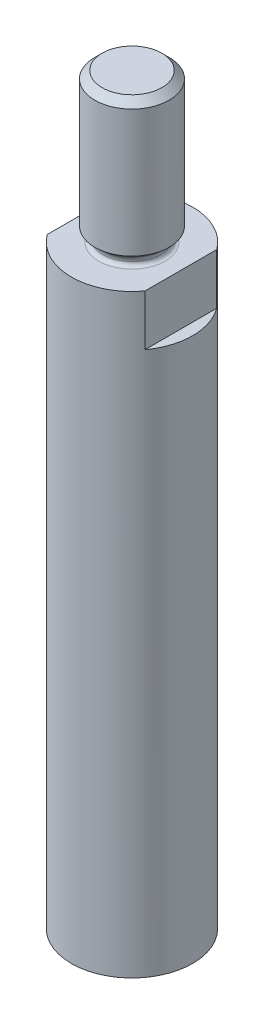
ISO-10303-21;
HEADER;
FILE_DESCRIPTION(('STEP AP214'),'2;1');
FILE_NAME('part.step','',(''),(''),'','','');
FILE_SCHEMA(('AUTOMOTIVE_DESIGN { 1 0 10303 214 1 1 1 1 }'));
ENDSEC;
DATA;
#1=APPLICATION_CONTEXT('core data for automotive mechanical design processes');
#2=APPLICATION_PROTOCOL_DEFINITION('international standard','automotive_design',2000,#1);
#3=PRODUCT_CONTEXT('',#1,'mechanical');
#4=PRODUCT('Part','Part','',(#3));
#5=PRODUCT_RELATED_PRODUCT_CATEGORY('part','',(#4));
#6=PRODUCT_DEFINITION_FORMATION('','',#4);
#7=PRODUCT_DEFINITION_CONTEXT('part definition',#1,'design');
#8=PRODUCT_DEFINITION('design','',#6,#7);
#9=PRODUCT_DEFINITION_SHAPE('','',#8);
#10=(LENGTH_UNIT() NAMED_UNIT(*) SI_UNIT(.MILLI.,.METRE.));
#11=(NAMED_UNIT(*) PLANE_ANGLE_UNIT() SI_UNIT($,.RADIAN.));
#12=(NAMED_UNIT(*) SI_UNIT($,.STERADIAN.) SOLID_ANGLE_UNIT());
#13=UNCERTAINTY_MEASURE_WITH_UNIT(LENGTH_MEASURE(1.E-05),#10,'distance_accuracy_value','');
#14=(GEOMETRIC_REPRESENTATION_CONTEXT(3) GLOBAL_UNCERTAINTY_ASSIGNED_CONTEXT((#13)) GLOBAL_UNIT_ASSIGNED_CONTEXT((#10,
#11,#12)) REPRESENTATION_CONTEXT('',''));
#15=CARTESIAN_POINT('',(0.,0.,0.));
#16=DIRECTION('',(0.,0.,1.));
#17=DIRECTION('',(1.,0.,0.));
#18=AXIS2_PLACEMENT_3D('',#15,#16,#17);
#19=CARTESIAN_POINT('',(0.,48.26,0.));
#20=DIRECTION('',(0.,-1.,0.));
#21=DIRECTION('',(0.,0.,-1.));
#22=AXIS2_PLACEMENT_3D('',#19,#20,#21);
#23=PLANE('',#22);
#24=CARTESIAN_POINT('',(0.,48.2600000000275,0.));
#25=DIRECTION('',(0.,-1.,0.));
#26=DIRECTION('',(1.,0.,0.));
#27=AXIS2_PLACEMENT_3D('',#24,#25,#26);
#28=CIRCLE('',#27,1.94055999998);
#29=CARTESIAN_POINT('',(1.94055999998,48.2600000000275,0.));
#30=VERTEX_POINT('',#29);
#31=EDGE_CURVE('E20',#30,#30,#28,.T.);
#32=ORIENTED_EDGE('',*,*,#31,.F.);
#33=EDGE_LOOP('',(#32));
#34=FACE_BOUND('',#33,.T.);
#35=ADVANCED_FACE('F17',(#34),#23,.F.);
#36=CARTESIAN_POINT('',(0.,47.7875600000743,0.));
#37=DIRECTION('',(0.,-1.,0.));
#38=DIRECTION('',(1.,0.,0.));
#39=AXIS2_PLACEMENT_3D('',#36,#37,#38);
#40=CONICAL_SURFACE('',#39,2.41299999993316,0.785398163397448);
#41=ORIENTED_EDGE('',*,*,#31,.T.);
#42=EDGE_LOOP('',(#41));
#43=FACE_BOUND('',#42,.T.);
#44=CARTESIAN_POINT('',(0.,47.78756,0.));
#45=DIRECTION('',(0.,1.,0.));
#46=DIRECTION('',(0.,0.,1.));
#47=AXIS2_PLACEMENT_3D('',#44,#45,#46);
#48=CIRCLE('',#47,2.413);
#49=CARTESIAN_POINT('',(0.,47.78756,2.413));
#50=VERTEX_POINT('',#49);
#51=EDGE_CURVE('E160',#50,#50,#48,.F.);
#52=ORIENTED_EDGE('',*,*,#51,.F.);
#53=EDGE_LOOP('',(#52));
#54=FACE_BOUND('',#53,.T.);
#55=ADVANCED_FACE('F247',(#43,#54),#40,.T.);
#56=CARTESIAN_POINT('',(0.,38.608,0.));
#57=DIRECTION('',(0.,1.,0.));
#58=DIRECTION('',(0.,0.,1.));
#59=AXIS2_PLACEMENT_3D('',#56,#57,#58);
#60=CYLINDRICAL_SURFACE('',#59,2.413);
#61=ORIENTED_EDGE('',*,*,#51,.T.);
#62=EDGE_LOOP('',(#61));
#63=FACE_BOUND('',#62,.T.);
#64=CARTESIAN_POINT('',(0.,39.5168626126292,0.));
#65=DIRECTION('',(0.,1.,0.));
#66=DIRECTION('',(0.,0.,1.));
#67=AXIS2_PLACEMENT_3D('',#64,#65,#66);
#68=CIRCLE('',#67,2.41299999993316);
#69=CARTESIAN_POINT('',(0.,39.5168626126292,2.41299999993316));
#70=VERTEX_POINT('',#69);
#71=EDGE_CURVE('E155',#70,#70,#68,.F.);
#72=ORIENTED_EDGE('',*,*,#71,.F.);
#73=EDGE_LOOP('',(#72));
#74=FACE_BOUND('',#73,.T.);
#75=ADVANCED_FACE('F238',(#63,#74),#60,.T.);
#76=CARTESIAN_POINT('',(0.,39.5168626126292,0.));
#77=DIRECTION('',(0.,1.,0.));
#78=DIRECTION('',(0.,0.,1.));
#79=AXIS2_PLACEMENT_3D('',#76,#77,#78);
#80=CONICAL_SURFACE('',#79,2.41299999993316,0.87266462603955);
#81=ORIENTED_EDGE('',*,*,#71,.T.);
#82=EDGE_LOOP('',(#81));
#83=FACE_BOUND('',#82,.T.);
#84=CARTESIAN_POINT('',(0.,39.2428662867617,0.));
#85=DIRECTION('',(0.,-1.,0.));
#86=DIRECTION('',(0.,0.,-1.));
#87=AXIS2_PLACEMENT_3D('',#84,#85,#86);
#88=CIRCLE('',#87,2.08646389427925);
#89=CARTESIAN_POINT('',(0.,39.2428662867617,-2.08646389427925));
#90=VERTEX_POINT('',#89);
#91=EDGE_CURVE('E140',#90,#90,#88,.F.);
#92=ORIENTED_EDGE('',*,*,#91,.T.);
#93=EDGE_LOOP('',(#92));
#94=FACE_BOUND('',#93,.T.);
#95=ADVANCED_FACE('F229',(#83,#94),#80,.T.);
#96=CARTESIAN_POINT('',(0.,38.8537157096573,0.));
#97=DIRECTION('',(0.,-1.,0.));
#98=DIRECTION('',(0.,0.,-1.));
#99=AXIS2_PLACEMENT_3D('',#96,#97,#98);
#100=TOROIDAL_SURFACE('',#99,2.41299999999999,0.507999999999985);
#101=ORIENTED_EDGE('',*,*,#91,.F.);
#102=EDGE_LOOP('',(#101));
#103=FACE_BOUND('',#102,.T.);
#104=CARTESIAN_POINT('',(0.,38.8585685575162,0.));
#105=DIRECTION('',(0.,-1.,0.));
#106=DIRECTION('',(0.,0.,-1.));
#107=AXIS2_PLACEMENT_3D('',#104,#105,#106);
#108=CIRCLE('',#107,1.90502317979296);
#109=CARTESIAN_POINT('',(0.,38.8585685575162,-1.90502317979296));
#110=VERTEX_POINT('',#109);
#111=EDGE_CURVE('E137',#110,#110,#108,.F.);
#112=ORIENTED_EDGE('',*,*,#111,.T.);
#113=EDGE_LOOP('',(#112));
#114=FACE_BOUND('',#113,.T.);
#115=ADVANCED_FACE('F129',(#103,#114),#100,.F.);
#116=CARTESIAN_POINT('',(0.,38.862,0.));
#117=DIRECTION('',(0.,-1.,0.));
#118=DIRECTION('',(0.,0.,-1.));
#119=AXIS2_PLACEMENT_3D('',#116,#117,#118);
#120=TOROIDAL_SURFACE('',#119,2.15899999999999,0.253999999999991);
#121=ORIENTED_EDGE('',*,*,#111,.F.);
#122=EDGE_LOOP('',(#121));
#123=FACE_BOUND('',#122,.T.);
#124=CARTESIAN_POINT('',(0.,38.608,0.));
#125=DIRECTION('',(0.,1.,0.));
#126=DIRECTION('',(0.,0.,-1.));
#127=AXIS2_PLACEMENT_3D('',#124,#125,#126);
#128=CIRCLE('',#127,2.15899999999999);
#129=CARTESIAN_POINT('',(0.,38.608,-2.15899999999999));
#130=VERTEX_POINT('',#129);
#131=EDGE_CURVE('E68',#130,#130,#128,.T.);
#132=ORIENTED_EDGE('',*,*,#131,.T.);
#133=EDGE_LOOP('',(#132));
#134=FACE_BOUND('',#133,.T.);
#135=ADVANCED_FACE('F123',(#123,#134),#120,.F.);
#136=CARTESIAN_POINT('',(3.937,0.,0.));
#137=DIRECTION('',(0.,1.,0.));
#138=DIRECTION('',(0.,0.,1.));
#139=AXIS2_PLACEMENT_3D('',#136,#137,#138);
#140=PLANE('',#139);
#141=CARTESIAN_POINT('',(0.,0.,0.));
#142=DIRECTION('',(0.,1.,0.));
#143=DIRECTION('',(0.,0.,1.));
#144=AXIS2_PLACEMENT_3D('',#141,#142,#143);
#145=CIRCLE('',#144,3.937);
#146=CARTESIAN_POINT('',(0.,0.,3.937));
#147=VERTEX_POINT('',#146);
#148=EDGE_CURVE('E84',#147,#147,#145,.T.);
#149=ORIENTED_EDGE('',*,*,#148,.F.);
#150=EDGE_LOOP('',(#149));
#151=FACE_BOUND('',#150,.T.);
#152=ADVANCED_FACE('F119',(#151),#140,.F.);
#153=CARTESIAN_POINT('',(0.,35.306,0.));
#154=DIRECTION('',(0.,1.,0.));
#155=DIRECTION('',(0.,0.,1.));
#156=AXIS2_PLACEMENT_3D('',#153,#154,#155);
#157=PLANE('',#156);
#158=CARTESIAN_POINT('',(0.,35.306,0.));
#159=DIRECTION('',(0.,1.,0.));
#160=DIRECTION('',(0.,0.,1.));
#161=AXIS2_PLACEMENT_3D('',#158,#159,#160);
#162=CIRCLE('',#161,3.937);
#163=CARTESIAN_POINT('',(-3.175,35.306,2.32794845303757));
#164=VERTEX_POINT('',#163);
#165=CARTESIAN_POINT('',(-3.175,35.306,-2.32794845303757));
#166=VERTEX_POINT('',#165);
#167=EDGE_CURVE('E77',#164,#166,#162,.F.);
#168=ORIENTED_EDGE('',*,*,#167,.F.);
#169=DIRECTION('',(0.,0.,1.));
#170=VECTOR('',#169,1.);
#171=CARTESIAN_POINT('',(-3.175,35.306,-7.874));
#172=LINE('',#171,#170);
#173=EDGE_CURVE('E69',#166,#164,#172,.T.);
#174=ORIENTED_EDGE('',*,*,#173,.F.);
#175=EDGE_LOOP('',(#168,#174));
#176=FACE_BOUND('',#175,.T.);
#177=ADVANCED_FACE('F116',(#176),#157,.T.);
#178=CARTESIAN_POINT('',(-3.175,35.306,-7.874));
#179=DIRECTION('',(-1.,0.,0.));
#180=DIRECTION('',(0.,0.,1.));
#181=AXIS2_PLACEMENT_3D('',#178,#179,#180);
#182=PLANE('',#181);
#183=DIRECTION('',(0.,1.,0.));
#184=VECTOR('',#183,1.);
#185=CARTESIAN_POINT('',(-3.175,0.,2.32794845303757));
#186=LINE('',#185,#184);
#187=CARTESIAN_POINT('',(-3.175,38.608,2.32794845303757));
#188=VERTEX_POINT('',#187);
#189=EDGE_CURVE('E72',#188,#164,#186,.F.);
#190=ORIENTED_EDGE('',*,*,#189,.F.);
#191=DIRECTION('',(0.,0.,-1.));
#192=VECTOR('',#191,1.);
#193=CARTESIAN_POINT('',(-3.175,38.608,0.));
#194=LINE('',#193,#192);
#195=CARTESIAN_POINT('',(-3.175,38.608,-2.32794845303757));
#196=VERTEX_POINT('',#195);
#197=EDGE_CURVE('E57',#188,#196,#194,.T.);
#198=ORIENTED_EDGE('',*,*,#197,.T.);
#199=DIRECTION('',(0.,1.,0.));
#200=VECTOR('',#199,1.);
#201=CARTESIAN_POINT('',(-3.175,0.,-2.32794845303757));
#202=LINE('',#201,#200);
#203=EDGE_CURVE('E166',#166,#196,#202,.T.);
#204=ORIENTED_EDGE('',*,*,#203,.F.);
#205=ORIENTED_EDGE('',*,*,#173,.T.);
#206=EDGE_LOOP('',(#190,#198,#204,#205));
#207=FACE_BOUND('',#206,.T.);
#208=ADVANCED_FACE('F73',(#207),#182,.T.);
#209=CARTESIAN_POINT('',(0.,38.608,0.));
#210=DIRECTION('',(0.,-1.,0.));
#211=DIRECTION('',(0.,0.,-1.));
#212=AXIS2_PLACEMENT_3D('',#209,#210,#211);
#213=PLANE('',#212);
#214=ORIENTED_EDGE('',*,*,#131,.F.);
#215=EDGE_LOOP('',(#214));
#216=FACE_BOUND('',#215,.T.);
#217=CARTESIAN_POINT('',(0.,38.608,0.));
#218=DIRECTION('',(0.,1.,0.));
#219=DIRECTION('',(0.,0.,1.));
#220=AXIS2_PLACEMENT_3D('',#217,#218,#219);
#221=CIRCLE('',#220,3.937);
#222=CARTESIAN_POINT('',(3.175,38.608,-2.32794845303757));
#223=VERTEX_POINT('',#222);
#224=EDGE_CURVE('E64',#196,#223,#221,.F.);
#225=ORIENTED_EDGE('',*,*,#224,.F.);
#226=ORIENTED_EDGE('',*,*,#197,.F.);
#227=CARTESIAN_POINT('',(0.,38.608,0.));
#228=DIRECTION('',(0.,1.,0.));
#229=DIRECTION('',(0.,0.,1.));
#230=AXIS2_PLACEMENT_3D('',#227,#228,#229);
#231=CIRCLE('',#230,3.937);
#232=CARTESIAN_POINT('',(3.175,38.608,2.32794845303757));
#233=VERTEX_POINT('',#232);
#234=EDGE_CURVE('E61',#233,#188,#231,.F.);
#235=ORIENTED_EDGE('',*,*,#234,.F.);
#236=DIRECTION('',(0.,0.,-1.));
#237=VECTOR('',#236,1.);
#238=CARTESIAN_POINT('',(3.175,38.608,7.874));
#239=LINE('',#238,#237);
#240=EDGE_CURVE('E52',#223,#233,#239,.F.);
#241=ORIENTED_EDGE('',*,*,#240,.F.);
#242=EDGE_LOOP('',(#225,#226,#235,#241));
#243=FACE_BOUND('',#242,.T.);
#244=ADVANCED_FACE('F59',(#216,#243),#213,.F.);
#245=CARTESIAN_POINT('',(3.175,35.306,7.874));
#246=DIRECTION('',(1.,0.,0.));
#247=DIRECTION('',(0.,0.,-1.));
#248=AXIS2_PLACEMENT_3D('',#245,#246,#247);
#249=PLANE('',#248);
#250=DIRECTION('',(0.,1.,0.));
#251=VECTOR('',#250,1.);
#252=CARTESIAN_POINT('',(3.175,0.,-2.32794845303757));
#253=LINE('',#252,#251);
#254=CARTESIAN_POINT('',(3.175,35.306,-2.32794845303757));
#255=VERTEX_POINT('',#254);
#256=EDGE_CURVE('E26',#223,#255,#253,.F.);
#257=ORIENTED_EDGE('',*,*,#256,.F.);
#258=ORIENTED_EDGE('',*,*,#240,.T.);
#259=DIRECTION('',(0.,1.,0.));
#260=VECTOR('',#259,1.);
#261=CARTESIAN_POINT('',(3.175,0.,2.32794845303757));
#262=LINE('',#261,#260);
#263=CARTESIAN_POINT('',(3.175,35.306,2.32794845303757));
#264=VERTEX_POINT('',#263);
#265=EDGE_CURVE('E82',#264,#233,#262,.T.);
#266=ORIENTED_EDGE('',*,*,#265,.F.);
#267=DIRECTION('',(0.,0.,1.));
#268=VECTOR('',#267,1.);
#269=CARTESIAN_POINT('',(3.175,35.306,0.));
#270=LINE('',#269,#268);
#271=EDGE_CURVE('E35',#255,#264,#270,.T.);
#272=ORIENTED_EDGE('',*,*,#271,.F.);
#273=EDGE_LOOP('',(#257,#258,#266,#272));
#274=FACE_BOUND('',#273,.T.);
#275=ADVANCED_FACE('F112',(#274),#249,.T.);
#276=CARTESIAN_POINT('',(0.,35.306,0.));
#277=DIRECTION('',(0.,1.,0.));
#278=DIRECTION('',(0.,0.,1.));
#279=AXIS2_PLACEMENT_3D('',#276,#277,#278);
#280=PLANE('',#279);
#281=ORIENTED_EDGE('',*,*,#271,.T.);
#282=CARTESIAN_POINT('',(0.,35.306,0.));
#283=DIRECTION('',(0.,1.,0.));
#284=DIRECTION('',(0.,0.,1.));
#285=AXIS2_PLACEMENT_3D('',#282,#283,#284);
#286=CIRCLE('',#285,3.937);
#287=EDGE_CURVE('E11',#255,#264,#286,.F.);
#288=ORIENTED_EDGE('',*,*,#287,.F.);
#289=EDGE_LOOP('',(#281,#288));
#290=FACE_BOUND('',#289,.T.);
#291=ADVANCED_FACE('F168',(#290),#280,.T.);
#292=CARTESIAN_POINT('',(0.,0.,0.));
#293=DIRECTION('',(0.,1.,0.));
#294=DIRECTION('',(0.,0.,1.));
#295=AXIS2_PLACEMENT_3D('',#292,#293,#294);
#296=CYLINDRICAL_SURFACE('',#295,3.937);
#297=ORIENTED_EDGE('',*,*,#256,.T.);
#298=ORIENTED_EDGE('',*,*,#287,.T.);
#299=ORIENTED_EDGE('',*,*,#265,.T.);
#300=ORIENTED_EDGE('',*,*,#234,.T.);
#301=ORIENTED_EDGE('',*,*,#189,.T.);
#302=ORIENTED_EDGE('',*,*,#167,.T.);
#303=ORIENTED_EDGE('',*,*,#203,.T.);
#304=ORIENTED_EDGE('',*,*,#224,.T.);
#305=EDGE_LOOP('',(#297,#298,#299,#300,#301,#302,#303,#304));
#306=FACE_BOUND('',#305,.T.);
#307=ORIENTED_EDGE('',*,*,#148,.T.);
#308=EDGE_LOOP('',(#307));
#309=FACE_BOUND('',#308,.T.);
#310=ADVANCED_FACE('F80',(#306,#309),#296,.T.);
#311=CLOSED_SHELL('',(#35,#55,#75,#95,#115,#135,#152,#177,#208,#244,#275,#291,#310));
#312=MANIFOLD_SOLID_BREP('B1',#311);
#313=ADVANCED_BREP_SHAPE_REPRESENTATION('',(#18,#312),#14);
#314=SHAPE_DEFINITION_REPRESENTATION(#9,#313);
ENDSEC;
END-ISO-10303-21;
